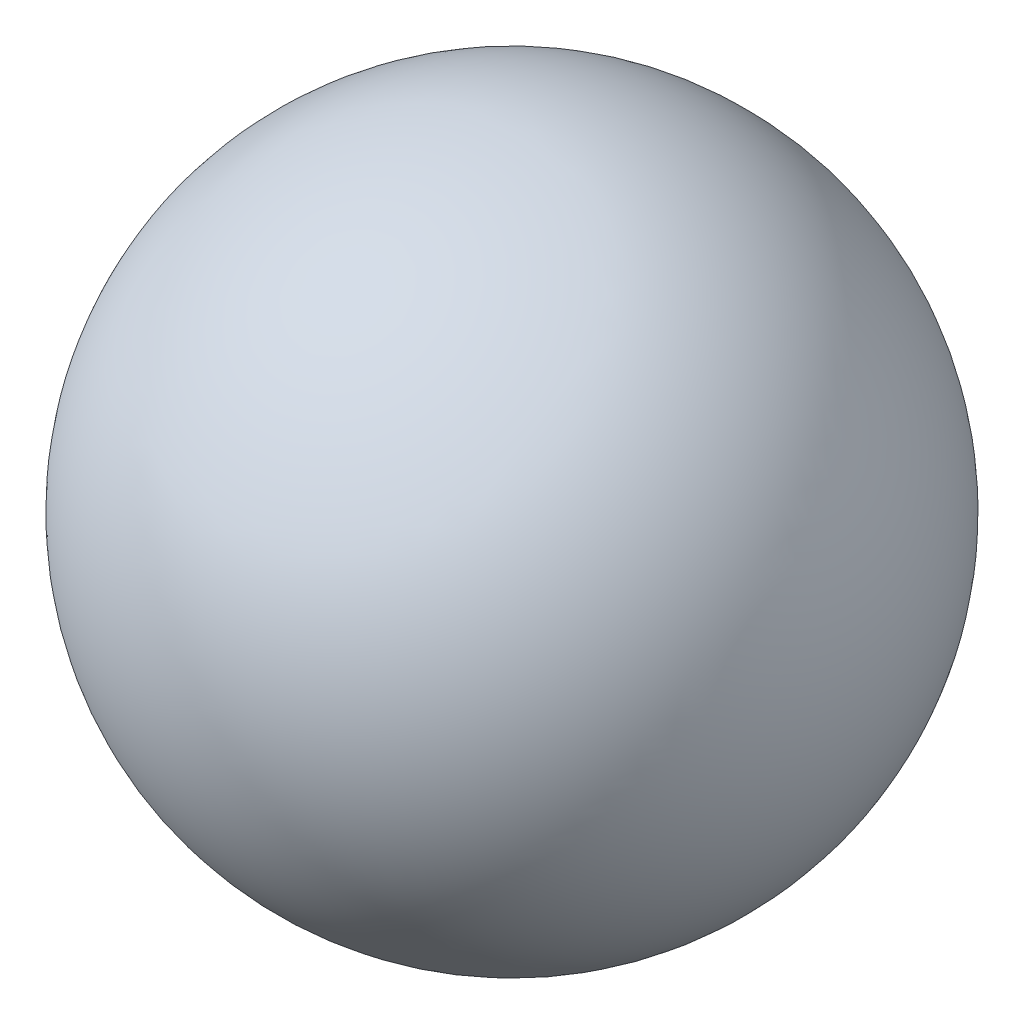
ISO-10303-21;
HEADER;
FILE_DESCRIPTION(('STEP AP214'),'2;1');
FILE_NAME('part.step','',(''),(''),'','','');
FILE_SCHEMA(('AUTOMOTIVE_DESIGN { 1 0 10303 214 1 1 1 1 }'));
ENDSEC;
DATA;
#1=APPLICATION_CONTEXT('core data for automotive mechanical design processes');
#2=APPLICATION_PROTOCOL_DEFINITION('international standard','automotive_design',2000,#1);
#3=PRODUCT_CONTEXT('',#1,'mechanical');
#4=PRODUCT('Part','Part','',(#3));
#5=PRODUCT_RELATED_PRODUCT_CATEGORY('part','',(#4));
#6=PRODUCT_DEFINITION_FORMATION('','',#4);
#7=PRODUCT_DEFINITION_CONTEXT('part definition',#1,'design');
#8=PRODUCT_DEFINITION('design','',#6,#7);
#9=PRODUCT_DEFINITION_SHAPE('','',#8);
#10=(LENGTH_UNIT() NAMED_UNIT(*) SI_UNIT(.MILLI.,.METRE.));
#11=(NAMED_UNIT(*) PLANE_ANGLE_UNIT() SI_UNIT($,.RADIAN.));
#12=(NAMED_UNIT(*) SI_UNIT($,.STERADIAN.) SOLID_ANGLE_UNIT());
#13=UNCERTAINTY_MEASURE_WITH_UNIT(LENGTH_MEASURE(1.E-05),#10,'distance_accuracy_value','');
#14=(GEOMETRIC_REPRESENTATION_CONTEXT(3) GLOBAL_UNCERTAINTY_ASSIGNED_CONTEXT((#13)) GLOBAL_UNIT_ASSIGNED_CONTEXT((#10,
#11,#12)) REPRESENTATION_CONTEXT('',''));
#15=CARTESIAN_POINT('',(0.,0.,0.));
#16=DIRECTION('',(0.,0.,1.));
#17=DIRECTION('',(1.,0.,0.));
#18=AXIS2_PLACEMENT_3D('',#15,#16,#17);
#19=CARTESIAN_POINT('',(0.,0.,0.));
#20=DIRECTION('',(-1.,0.,0.));
#21=DIRECTION('',(0.,1.,0.));
#22=AXIS2_PLACEMENT_3D('',#19,#20,#21);
#23=SPHERICAL_SURFACE('',#22,120.);
#24=CARTESIAN_POINT('',(-120.,0.,0.));
#25=VERTEX_POINT('',#24);
#26=VERTEX_LOOP('',#25);
#27=FACE_BOUND('',#26,.T.);
#28=ADVANCED_FACE('F29',(#27),#23,.T.);
#29=CLOSED_SHELL('',(#28));
#30=MANIFOLD_SOLID_BREP('B2',#29);
#31=ADVANCED_BREP_SHAPE_REPRESENTATION('',(#18,#30),#14);
#32=SHAPE_DEFINITION_REPRESENTATION(#9,#31);
ENDSEC;
END-ISO-10303-21;
